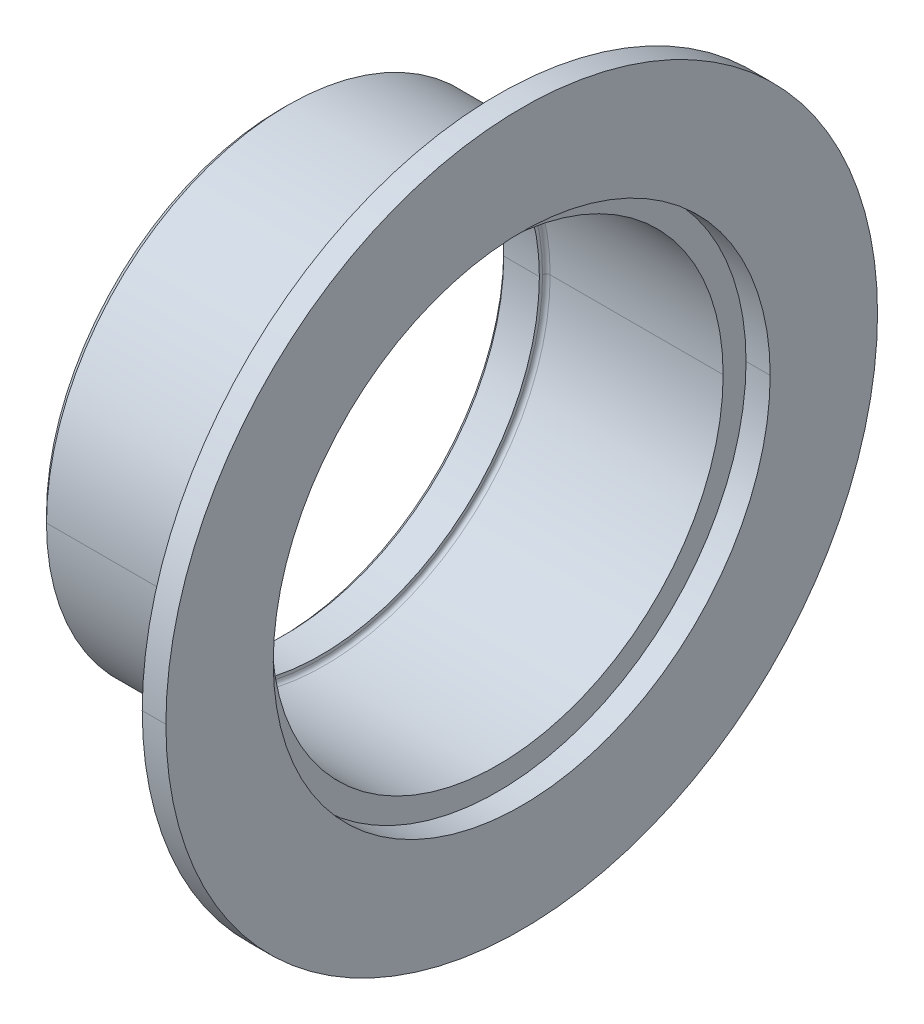
ISO-10303-21;
HEADER;
FILE_DESCRIPTION(('STEP AP214'),'2;1');
FILE_NAME('part.step','',(''),(''),'','','');
FILE_SCHEMA(('AUTOMOTIVE_DESIGN { 1 0 10303 214 1 1 1 1 }'));
ENDSEC;
DATA;
#1=APPLICATION_CONTEXT('core data for automotive mechanical design processes');
#2=APPLICATION_PROTOCOL_DEFINITION('international standard','automotive_design',2000,#1);
#3=PRODUCT_CONTEXT('',#1,'mechanical');
#4=PRODUCT('Part','Part','',(#3));
#5=PRODUCT_RELATED_PRODUCT_CATEGORY('part','',(#4));
#6=PRODUCT_DEFINITION_FORMATION('','',#4);
#7=PRODUCT_DEFINITION_CONTEXT('part definition',#1,'design');
#8=PRODUCT_DEFINITION('design','',#6,#7);
#9=PRODUCT_DEFINITION_SHAPE('','',#8);
#10=(LENGTH_UNIT() NAMED_UNIT(*) SI_UNIT(.MILLI.,.METRE.));
#11=(NAMED_UNIT(*) PLANE_ANGLE_UNIT() SI_UNIT($,.RADIAN.));
#12=(NAMED_UNIT(*) SI_UNIT($,.STERADIAN.) SOLID_ANGLE_UNIT());
#13=UNCERTAINTY_MEASURE_WITH_UNIT(LENGTH_MEASURE(1.E-05),#10,'distance_accuracy_value','');
#14=(GEOMETRIC_REPRESENTATION_CONTEXT(3) GLOBAL_UNCERTAINTY_ASSIGNED_CONTEXT((#13)) GLOBAL_UNIT_ASSIGNED_CONTEXT((#10,
#11,#12)) REPRESENTATION_CONTEXT('',''));
#15=CARTESIAN_POINT('',(0.,0.,0.));
#16=DIRECTION('',(0.,0.,1.));
#17=DIRECTION('',(1.,0.,0.));
#18=AXIS2_PLACEMENT_3D('',#15,#16,#17);
#19=CARTESIAN_POINT('',(-20.75,0.,0.));
#20=DIRECTION('',(1.,0.,0.));
#21=DIRECTION('',(0.,0.,-1.));
#22=AXIS2_PLACEMENT_3D('',#19,#20,#21);
#23=TOROIDAL_SURFACE('',#22,23.35,0.4);
#24=CARTESIAN_POINT('',(-21.15,0.,0.));
#25=DIRECTION('',(1.,0.,0.));
#26=DIRECTION('',(0.,0.,-1.));
#27=AXIS2_PLACEMENT_3D('',#24,#25,#26);
#28=CIRCLE('',#27,23.35);
#29=CARTESIAN_POINT('',(-21.15,0.,23.35));
#30=VERTEX_POINT('',#29);
#31=CARTESIAN_POINT('',(-21.15,0.,-23.35));
#32=VERTEX_POINT('',#31);
#33=EDGE_CURVE('E42',#30,#32,#28,.T.);
#34=ORIENTED_EDGE('',*,*,#33,.F.);
#35=CARTESIAN_POINT('',(-20.75,0.,23.35));
#36=DIRECTION('',(0.,1.,0.));
#37=DIRECTION('',(0.,0.,1.));
#38=AXIS2_PLACEMENT_3D('',#35,#36,#37);
#39=CIRCLE('',#38,0.4);
#40=CARTESIAN_POINT('',(-20.75,0.,23.75));
#41=VERTEX_POINT('',#40);
#42=EDGE_CURVE('E11',#30,#41,#39,.T.);
#43=ORIENTED_EDGE('',*,*,#42,.T.);
#44=CARTESIAN_POINT('',(-20.75,0.,0.));
#45=DIRECTION('',(-1.,0.,0.));
#46=DIRECTION('',(0.,0.,-1.));
#47=AXIS2_PLACEMENT_3D('',#44,#45,#46);
#48=CIRCLE('',#47,23.75);
#49=CARTESIAN_POINT('',(-20.75,0.,-23.75));
#50=VERTEX_POINT('',#49);
#51=EDGE_CURVE('E248',#50,#41,#48,.T.);
#52=ORIENTED_EDGE('',*,*,#51,.F.);
#53=CARTESIAN_POINT('',(-20.75,0.,-23.35));
#54=DIRECTION('',(0.,-1.,0.));
#55=DIRECTION('',(0.,0.,-1.));
#56=AXIS2_PLACEMENT_3D('',#53,#54,#55);
#57=CIRCLE('',#56,0.4);
#58=EDGE_CURVE('E187',#32,#50,#57,.T.);
#59=ORIENTED_EDGE('',*,*,#58,.F.);
#60=EDGE_LOOP('',(#34,#43,#52,#59));
#61=FACE_BOUND('',#60,.T.);
#62=ADVANCED_FACE('F17',(#61),#23,.F.);
#63=CARTESIAN_POINT('',(-24.9,0.,0.));
#64=DIRECTION('',(-1.,0.,0.));
#65=DIRECTION('',(0.,0.,1.));
#66=AXIS2_PLACEMENT_3D('',#63,#64,#65);
#67=CONICAL_SURFACE('',#66,23.01,0.785398163397448);
#68=CARTESIAN_POINT('',(-24.9,0.,0.));
#69=DIRECTION('',(-1.,0.,0.));
#70=DIRECTION('',(0.,0.,-1.));
#71=AXIS2_PLACEMENT_3D('',#68,#69,#70);
#72=CIRCLE('',#71,23.01);
#73=CARTESIAN_POINT('',(-24.9,0.,-23.01));
#74=VERTEX_POINT('',#73);
#75=CARTESIAN_POINT('',(-24.9,0.,23.01));
#76=VERTEX_POINT('',#75);
#77=EDGE_CURVE('E164',#74,#76,#72,.T.);
#78=ORIENTED_EDGE('',*,*,#77,.F.);
#79=DIRECTION('',(-0.707106781186548,0.,-0.707106781186548));
#80=VECTOR('',#79,1.);
#81=CARTESIAN_POINT('',(-24.9,0.,-23.01));
#82=LINE('',#81,#80);
#83=CARTESIAN_POINT('',(-25.4,0.,-23.51));
#84=VERTEX_POINT('',#83);
#85=EDGE_CURVE('E28',#74,#84,#82,.T.);
#86=ORIENTED_EDGE('',*,*,#85,.T.);
#87=CARTESIAN_POINT('',(-25.4,0.,0.));
#88=DIRECTION('',(1.,0.,0.));
#89=DIRECTION('',(0.,0.,-1.));
#90=AXIS2_PLACEMENT_3D('',#87,#88,#89);
#91=CIRCLE('',#90,23.51);
#92=CARTESIAN_POINT('',(-25.4,0.,23.51));
#93=VERTEX_POINT('',#92);
#94=EDGE_CURVE('E153',#93,#84,#91,.T.);
#95=ORIENTED_EDGE('',*,*,#94,.F.);
#96=DIRECTION('',(-0.707106781186548,0.,0.707106781186548));
#97=VECTOR('',#96,1.);
#98=CARTESIAN_POINT('',(-24.9,0.,23.01));
#99=LINE('',#98,#97);
#100=EDGE_CURVE('E173',#76,#93,#99,.T.);
#101=ORIENTED_EDGE('',*,*,#100,.F.);
#102=EDGE_LOOP('',(#78,#86,#95,#101));
#103=FACE_BOUND('',#102,.T.);
#104=ADVANCED_FACE('F163',(#103),#67,.F.);
#105=CARTESIAN_POINT('',(0.,0.,0.));
#106=DIRECTION('',(-1.,0.,0.));
#107=DIRECTION('',(0.,0.,1.));
#108=AXIS2_PLACEMENT_3D('',#105,#106,#107);
#109=CYLINDRICAL_SURFACE('',#108,23.01);
#110=CARTESIAN_POINT('',(-21.15,0.,0.));
#111=DIRECTION('',(-1.,0.,0.));
#112=DIRECTION('',(0.,0.,1.));
#113=AXIS2_PLACEMENT_3D('',#110,#111,#112);
#114=CIRCLE('',#113,23.01);
#115=CARTESIAN_POINT('',(-21.15,0.,-23.01));
#116=VERTEX_POINT('',#115);
#117=CARTESIAN_POINT('',(-21.15,0.,23.01));
#118=VERTEX_POINT('',#117);
#119=EDGE_CURVE('E195',#116,#118,#114,.T.);
#120=ORIENTED_EDGE('',*,*,#119,.F.);
#121=DIRECTION('',(-1.,0.,0.));
#122=VECTOR('',#121,1.);
#123=CARTESIAN_POINT('',(0.,0.,-23.01));
#124=LINE('',#123,#122);
#125=EDGE_CURVE('E170',#116,#74,#124,.T.);
#126=ORIENTED_EDGE('',*,*,#125,.T.);
#127=ORIENTED_EDGE('',*,*,#77,.T.);
#128=DIRECTION('',(-1.,0.,0.));
#129=VECTOR('',#128,1.);
#130=CARTESIAN_POINT('',(0.,0.,23.01));
#131=LINE('',#130,#129);
#132=EDGE_CURVE('E125',#118,#76,#131,.T.);
#133=ORIENTED_EDGE('',*,*,#132,.F.);
#134=EDGE_LOOP('',(#120,#126,#127,#133));
#135=FACE_BOUND('',#134,.T.);
#136=ADVANCED_FACE('F327',(#135),#109,.F.);
#137=CARTESIAN_POINT('',(0.,0.,0.));
#138=DIRECTION('',(-1.,0.,0.));
#139=DIRECTION('',(0.,0.,1.));
#140=AXIS2_PLACEMENT_3D('',#137,#138,#139);
#141=CYLINDRICAL_SURFACE('',#140,23.75);
#142=CARTESIAN_POINT('',(-2.54,0.,0.));
#143=DIRECTION('',(-1.,0.,0.));
#144=DIRECTION('',(0.,0.,-1.));
#145=AXIS2_PLACEMENT_3D('',#142,#143,#144);
#146=CIRCLE('',#145,23.75);
#147=CARTESIAN_POINT('',(-2.54,0.,-23.75));
#148=VERTEX_POINT('',#147);
#149=CARTESIAN_POINT('',(-2.54,0.,23.75));
#150=VERTEX_POINT('',#149);
#151=EDGE_CURVE('E137',#148,#150,#146,.T.);
#152=ORIENTED_EDGE('',*,*,#151,.F.);
#153=DIRECTION('',(-1.,0.,0.));
#154=VECTOR('',#153,1.);
#155=CARTESIAN_POINT('',(0.,0.,-23.75));
#156=LINE('',#155,#154);
#157=EDGE_CURVE('E245',#148,#50,#156,.T.);
#158=ORIENTED_EDGE('',*,*,#157,.T.);
#159=ORIENTED_EDGE('',*,*,#51,.T.);
#160=DIRECTION('',(-1.,0.,0.));
#161=VECTOR('',#160,1.);
#162=CARTESIAN_POINT('',(0.,0.,23.75));
#163=LINE('',#162,#161);
#164=EDGE_CURVE('E175',#150,#41,#163,.T.);
#165=ORIENTED_EDGE('',*,*,#164,.F.);
#166=EDGE_LOOP('',(#152,#158,#159,#165));
#167=FACE_BOUND('',#166,.T.);
#168=ADVANCED_FACE('F313',(#167),#141,.F.);
#169=CARTESIAN_POINT('',(0.,0.,0.));
#170=DIRECTION('',(1.,0.,0.));
#171=DIRECTION('',(0.,0.,-1.));
#172=AXIS2_PLACEMENT_3D('',#169,#170,#171);
#173=CYLINDRICAL_SURFACE('',#172,26.162);
#174=CARTESIAN_POINT('',(-2.54,0.,0.));
#175=DIRECTION('',(1.,0.,0.));
#176=DIRECTION('',(0.,0.,-1.));
#177=AXIS2_PLACEMENT_3D('',#174,#175,#176);
#178=CIRCLE('',#177,26.162);
#179=CARTESIAN_POINT('',(-2.54,0.,26.162));
#180=VERTEX_POINT('',#179);
#181=CARTESIAN_POINT('',(-2.54,0.,-26.162));
#182=VERTEX_POINT('',#181);
#183=EDGE_CURVE('E265',#180,#182,#178,.T.);
#184=ORIENTED_EDGE('',*,*,#183,.F.);
#185=DIRECTION('',(1.,0.,0.));
#186=VECTOR('',#185,1.);
#187=CARTESIAN_POINT('',(0.,0.,26.162));
#188=LINE('',#187,#186);
#189=CARTESIAN_POINT('',(0.,0.,26.162));
#190=VERTEX_POINT('',#189);
#191=EDGE_CURVE('E230',#180,#190,#188,.T.);
#192=ORIENTED_EDGE('',*,*,#191,.T.);
#193=CARTESIAN_POINT('',(0.,0.,0.));
#194=DIRECTION('',(-1.,0.,0.));
#195=DIRECTION('',(0.,0.,-1.));
#196=AXIS2_PLACEMENT_3D('',#193,#194,#195);
#197=CIRCLE('',#196,26.162);
#198=CARTESIAN_POINT('',(0.,0.,-26.162));
#199=VERTEX_POINT('',#198);
#200=EDGE_CURVE('E220',#199,#190,#197,.T.);
#201=ORIENTED_EDGE('',*,*,#200,.F.);
#202=DIRECTION('',(1.,0.,0.));
#203=VECTOR('',#202,1.);
#204=CARTESIAN_POINT('',(0.,0.,-26.162));
#205=LINE('',#204,#203);
#206=EDGE_CURVE('E241',#182,#199,#205,.T.);
#207=ORIENTED_EDGE('',*,*,#206,.F.);
#208=EDGE_LOOP('',(#184,#192,#201,#207));
#209=FACE_BOUND('',#208,.T.);
#210=ADVANCED_FACE('F336',(#209),#173,.F.);
#211=CARTESIAN_POINT('',(-26.67,0.,0.));
#212=DIRECTION('',(1.,0.,0.));
#213=DIRECTION('',(0.,0.,-1.));
#214=AXIS2_PLACEMENT_3D('',#211,#212,#213);
#215=CYLINDRICAL_SURFACE('',#214,37.465);
#216=CARTESIAN_POINT('',(-2.4892,0.,0.));
#217=DIRECTION('',(1.,0.,0.));
#218=DIRECTION('',(0.,0.,-1.));
#219=AXIS2_PLACEMENT_3D('',#216,#217,#218);
#220=CIRCLE('',#219,37.465);
#221=CARTESIAN_POINT('',(-2.4892,0.,-37.4649999999949));
#222=VERTEX_POINT('',#221);
#223=CARTESIAN_POINT('',(-2.4892,0.,37.4649999999949));
#224=VERTEX_POINT('',#223);
#225=EDGE_CURVE('E226',#222,#224,#220,.T.);
#226=ORIENTED_EDGE('',*,*,#225,.T.);
#227=DIRECTION('',(1.,0.,0.));
#228=VECTOR('',#227,1.);
#229=CARTESIAN_POINT('',(-26.67,0.,37.465));
#230=LINE('',#229,#228);
#231=CARTESIAN_POINT('',(0.,0.,37.465));
#232=VERTEX_POINT('',#231);
#233=EDGE_CURVE('E212',#224,#232,#230,.T.);
#234=ORIENTED_EDGE('',*,*,#233,.T.);
#235=CARTESIAN_POINT('',(0.,0.,0.));
#236=DIRECTION('',(1.,0.,0.));
#237=DIRECTION('',(0.,0.,-1.));
#238=AXIS2_PLACEMENT_3D('',#235,#236,#237);
#239=CIRCLE('',#238,37.465);
#240=CARTESIAN_POINT('',(0.,0.,-37.465));
#241=VERTEX_POINT('',#240);
#242=EDGE_CURVE('E238',#241,#232,#239,.T.);
#243=ORIENTED_EDGE('',*,*,#242,.F.);
#244=DIRECTION('',(1.,0.,0.));
#245=VECTOR('',#244,1.);
#246=CARTESIAN_POINT('',(-26.67,0.,-37.465));
#247=LINE('',#246,#245);
#248=EDGE_CURVE('E255',#222,#241,#247,.T.);
#249=ORIENTED_EDGE('',*,*,#248,.F.);
#250=EDGE_LOOP('',(#226,#234,#243,#249));
#251=FACE_BOUND('',#250,.T.);
#252=ADVANCED_FACE('F371',(#251),#215,.T.);
#253=CARTESIAN_POINT('',(-2.48919999999871,0.,0.));
#254=DIRECTION('',(1.,0.,0.));
#255=DIRECTION('',(0.,0.,-1.));
#256=AXIS2_PLACEMENT_3D('',#253,#254,#255);
#257=CONICAL_SURFACE('',#256,37.465,1.3089969389955);
#258=CARTESIAN_POINT('',(-5.72200700668321,0.,0.));
#259=DIRECTION('',(1.,0.,0.));
#260=DIRECTION('',(0.,-1.,0.));
#261=AXIS2_PLACEMENT_3D('',#258,#259,#260);
#262=CIRCLE('',#261,25.4000000000004);
#263=CARTESIAN_POINT('',(-5.72200700668321,0.,-25.4000000000004));
#264=VERTEX_POINT('',#263);
#265=CARTESIAN_POINT('',(-5.72200700668321,0.,25.4000000000004));
#266=VERTEX_POINT('',#265);
#267=EDGE_CURVE('E208',#264,#266,#262,.T.);
#268=ORIENTED_EDGE('',*,*,#267,.T.);
#269=DIRECTION('',(0.25881904510276,0.,0.965925826289004));
#270=VECTOR('',#269,1.);
#271=CARTESIAN_POINT('',(-2.48919999999871,0.,37.465));
#272=LINE('',#271,#270);
#273=EDGE_CURVE('E213',#266,#224,#272,.T.);
#274=ORIENTED_EDGE('',*,*,#273,.T.);
#275=ORIENTED_EDGE('',*,*,#225,.F.);
#276=DIRECTION('',(0.25881904510276,0.,-0.965925826289004));
#277=VECTOR('',#276,1.);
#278=CARTESIAN_POINT('',(-2.48919999999871,0.,-37.465));
#279=LINE('',#278,#277);
#280=EDGE_CURVE('E207',#264,#222,#279,.T.);
#281=ORIENTED_EDGE('',*,*,#280,.F.);
#282=EDGE_LOOP('',(#268,#274,#275,#281));
#283=FACE_BOUND('',#282,.T.);
#284=ADVANCED_FACE('F366',(#283),#257,.T.);
#285=CARTESIAN_POINT('',(-26.67,0.,0.));
#286=DIRECTION('',(1.,0.,0.));
#287=DIRECTION('',(0.,0.,-1.));
#288=AXIS2_PLACEMENT_3D('',#285,#286,#287);
#289=CYLINDRICAL_SURFACE('',#288,25.4);
#290=CARTESIAN_POINT('',(-24.638,0.,0.));
#291=DIRECTION('',(1.,0.,0.));
#292=DIRECTION('',(0.,0.,-1.));
#293=AXIS2_PLACEMENT_3D('',#290,#291,#292);
#294=CIRCLE('',#293,25.4);
#295=CARTESIAN_POINT('',(-24.638,0.,-25.4));
#296=VERTEX_POINT('',#295);
#297=CARTESIAN_POINT('',(-24.638,0.,25.4));
#298=VERTEX_POINT('',#297);
#299=EDGE_CURVE('E266',#296,#298,#294,.T.);
#300=ORIENTED_EDGE('',*,*,#299,.T.);
#301=DIRECTION('',(1.,0.,0.));
#302=VECTOR('',#301,1.);
#303=CARTESIAN_POINT('',(-26.67,0.,25.4));
#304=LINE('',#303,#302);
#305=EDGE_CURVE('E270',#298,#266,#304,.T.);
#306=ORIENTED_EDGE('',*,*,#305,.T.);
#307=ORIENTED_EDGE('',*,*,#267,.F.);
#308=DIRECTION('',(1.,0.,0.));
#309=VECTOR('',#308,1.);
#310=CARTESIAN_POINT('',(-26.67,0.,-25.4));
#311=LINE('',#310,#309);
#312=EDGE_CURVE('E186',#296,#264,#311,.T.);
#313=ORIENTED_EDGE('',*,*,#312,.F.);
#314=EDGE_LOOP('',(#300,#306,#307,#313));
#315=FACE_BOUND('',#314,.T.);
#316=ADVANCED_FACE('F363',(#315),#289,.T.);
#317=CARTESIAN_POINT('',(-24.638,0.,0.));
#318=DIRECTION('',(1.,0.,0.));
#319=DIRECTION('',(0.,0.,-1.));
#320=AXIS2_PLACEMENT_3D('',#317,#318,#319);
#321=CONICAL_SURFACE('',#320,25.4,0.785398163397298);
#322=CARTESIAN_POINT('',(-25.4,0.,0.));
#323=DIRECTION('',(1.,0.,0.));
#324=DIRECTION('',(0.,0.,-1.));
#325=AXIS2_PLACEMENT_3D('',#322,#323,#324);
#326=CIRCLE('',#325,24.638);
#327=CARTESIAN_POINT('',(-25.4,0.,-24.638));
#328=VERTEX_POINT('',#327);
#329=CARTESIAN_POINT('',(-25.4,0.,24.638));
#330=VERTEX_POINT('',#329);
#331=EDGE_CURVE('E237',#328,#330,#326,.T.);
#332=ORIENTED_EDGE('',*,*,#331,.T.);
#333=DIRECTION('',(0.707106781186654,0.,0.707106781186441));
#334=VECTOR('',#333,1.);
#335=CARTESIAN_POINT('',(-24.638,0.,25.4));
#336=LINE('',#335,#334);
#337=EDGE_CURVE('E234',#330,#298,#336,.T.);
#338=ORIENTED_EDGE('',*,*,#337,.T.);
#339=ORIENTED_EDGE('',*,*,#299,.F.);
#340=DIRECTION('',(0.707106781186654,0.,-0.707106781186441));
#341=VECTOR('',#340,1.);
#342=CARTESIAN_POINT('',(-24.638,0.,-25.4));
#343=LINE('',#342,#341);
#344=EDGE_CURVE('E160',#328,#296,#343,.T.);
#345=ORIENTED_EDGE('',*,*,#344,.F.);
#346=EDGE_LOOP('',(#332,#338,#339,#345));
#347=FACE_BOUND('',#346,.T.);
#348=ADVANCED_FACE('F365',(#347),#321,.T.);
#349=CARTESIAN_POINT('',(0.,0.,0.));
#350=DIRECTION('',(1.,0.,0.));
#351=DIRECTION('',(0.,1.,0.));
#352=AXIS2_PLACEMENT_3D('',#349,#350,#351);
#353=PLANE('',#352);
#354=ORIENTED_EDGE('',*,*,#242,.T.);
#355=CARTESIAN_POINT('',(0.,0.,0.));
#356=DIRECTION('',(1.,0.,0.));
#357=DIRECTION('',(0.,0.,-1.));
#358=AXIS2_PLACEMENT_3D('',#355,#356,#357);
#359=CIRCLE('',#358,37.465);
#360=EDGE_CURVE('E224',#232,#241,#359,.T.);
#361=ORIENTED_EDGE('',*,*,#360,.T.);
#362=EDGE_LOOP('',(#354,#361));
#363=FACE_BOUND('',#362,.T.);
#364=ORIENTED_EDGE('',*,*,#200,.T.);
#365=CARTESIAN_POINT('',(0.,0.,0.));
#366=DIRECTION('',(-1.,0.,0.));
#367=DIRECTION('',(0.,0.,-1.));
#368=AXIS2_PLACEMENT_3D('',#365,#366,#367);
#369=CIRCLE('',#368,26.162);
#370=EDGE_CURVE('E225',#190,#199,#369,.T.);
#371=ORIENTED_EDGE('',*,*,#370,.T.);
#372=EDGE_LOOP('',(#364,#371));
#373=FACE_BOUND('',#372,.T.);
#374=ADVANCED_FACE('F361',(#363,#373),#353,.T.);
#375=CARTESIAN_POINT('',(0.,0.,0.));
#376=DIRECTION('',(1.,0.,0.));
#377=DIRECTION('',(0.,0.,-1.));
#378=AXIS2_PLACEMENT_3D('',#375,#376,#377);
#379=CYLINDRICAL_SURFACE('',#378,26.162);
#380=ORIENTED_EDGE('',*,*,#191,.F.);
#381=CARTESIAN_POINT('',(-2.54,0.,0.));
#382=DIRECTION('',(1.,0.,0.));
#383=DIRECTION('',(0.,0.,-1.));
#384=AXIS2_PLACEMENT_3D('',#381,#382,#383);
#385=CIRCLE('',#384,26.162);
#386=EDGE_CURVE('E258',#182,#180,#385,.T.);
#387=ORIENTED_EDGE('',*,*,#386,.F.);
#388=ORIENTED_EDGE('',*,*,#206,.T.);
#389=ORIENTED_EDGE('',*,*,#370,.F.);
#390=EDGE_LOOP('',(#380,#387,#388,#389));
#391=FACE_BOUND('',#390,.T.);
#392=ADVANCED_FACE('F357',(#391),#379,.F.);
#393=CARTESIAN_POINT('',(-26.67,0.,0.));
#394=DIRECTION('',(1.,0.,0.));
#395=DIRECTION('',(0.,0.,-1.));
#396=AXIS2_PLACEMENT_3D('',#393,#394,#395);
#397=CYLINDRICAL_SURFACE('',#396,37.465);
#398=ORIENTED_EDGE('',*,*,#233,.F.);
#399=CARTESIAN_POINT('',(-2.4892,0.,0.));
#400=DIRECTION('',(1.,0.,0.));
#401=DIRECTION('',(0.,0.,-1.));
#402=AXIS2_PLACEMENT_3D('',#399,#400,#401);
#403=CIRCLE('',#402,37.465);
#404=EDGE_CURVE('E243',#224,#222,#403,.T.);
#405=ORIENTED_EDGE('',*,*,#404,.T.);
#406=ORIENTED_EDGE('',*,*,#248,.T.);
#407=ORIENTED_EDGE('',*,*,#360,.F.);
#408=EDGE_LOOP('',(#398,#405,#406,#407));
#409=FACE_BOUND('',#408,.T.);
#410=ADVANCED_FACE('F360',(#409),#397,.T.);
#411=CARTESIAN_POINT('',(-2.54,0.,0.));
#412=DIRECTION('',(1.,0.,0.));
#413=DIRECTION('',(0.,1.,0.));
#414=AXIS2_PLACEMENT_3D('',#411,#412,#413);
#415=PLANE('',#414);
#416=ORIENTED_EDGE('',*,*,#386,.T.);
#417=ORIENTED_EDGE('',*,*,#183,.T.);
#418=EDGE_LOOP('',(#416,#417));
#419=FACE_BOUND('',#418,.T.);
#420=CARTESIAN_POINT('',(-2.54,0.,0.));
#421=DIRECTION('',(-1.,0.,0.));
#422=DIRECTION('',(0.,0.,-1.));
#423=AXIS2_PLACEMENT_3D('',#420,#421,#422);
#424=CIRCLE('',#423,23.75);
#425=EDGE_CURVE('E286',#150,#148,#424,.T.);
#426=ORIENTED_EDGE('',*,*,#425,.T.);
#427=ORIENTED_EDGE('',*,*,#151,.T.);
#428=EDGE_LOOP('',(#426,#427));
#429=FACE_BOUND('',#428,.T.);
#430=ADVANCED_FACE('F19',(#419,#429),#415,.T.);
#431=CARTESIAN_POINT('',(-2.48919999999871,0.,0.));
#432=DIRECTION('',(1.,0.,0.));
#433=DIRECTION('',(0.,0.,-1.));
#434=AXIS2_PLACEMENT_3D('',#431,#432,#433);
#435=CONICAL_SURFACE('',#434,37.465,1.3089969389955);
#436=ORIENTED_EDGE('',*,*,#273,.F.);
#437=CARTESIAN_POINT('',(-5.72200700668321,0.,0.));
#438=DIRECTION('',(1.,0.,0.));
#439=DIRECTION('',(0.,-1.,0.));
#440=AXIS2_PLACEMENT_3D('',#437,#438,#439);
#441=CIRCLE('',#440,25.4000000000004);
#442=EDGE_CURVE('E203',#266,#264,#441,.T.);
#443=ORIENTED_EDGE('',*,*,#442,.T.);
#444=ORIENTED_EDGE('',*,*,#280,.T.);
#445=ORIENTED_EDGE('',*,*,#404,.F.);
#446=EDGE_LOOP('',(#436,#443,#444,#445));
#447=FACE_BOUND('',#446,.T.);
#448=ADVANCED_FACE('F352',(#447),#435,.T.);
#449=CARTESIAN_POINT('',(-26.67,0.,0.));
#450=DIRECTION('',(1.,0.,0.));
#451=DIRECTION('',(0.,0.,-1.));
#452=AXIS2_PLACEMENT_3D('',#449,#450,#451);
#453=CYLINDRICAL_SURFACE('',#452,25.4);
#454=ORIENTED_EDGE('',*,*,#305,.F.);
#455=CARTESIAN_POINT('',(-24.638,0.,0.));
#456=DIRECTION('',(1.,0.,0.));
#457=DIRECTION('',(0.,0.,-1.));
#458=AXIS2_PLACEMENT_3D('',#455,#456,#457);
#459=CIRCLE('',#458,25.4);
#460=EDGE_CURVE('E216',#298,#296,#459,.T.);
#461=ORIENTED_EDGE('',*,*,#460,.T.);
#462=ORIENTED_EDGE('',*,*,#312,.T.);
#463=ORIENTED_EDGE('',*,*,#442,.F.);
#464=EDGE_LOOP('',(#454,#461,#462,#463));
#465=FACE_BOUND('',#464,.T.);
#466=ADVANCED_FACE('F350',(#465),#453,.T.);
#467=CARTESIAN_POINT('',(-24.638,0.,0.));
#468=DIRECTION('',(1.,0.,0.));
#469=DIRECTION('',(0.,0.,-1.));
#470=AXIS2_PLACEMENT_3D('',#467,#468,#469);
#471=CONICAL_SURFACE('',#470,25.4,0.785398163397298);
#472=ORIENTED_EDGE('',*,*,#337,.F.);
#473=CARTESIAN_POINT('',(-25.4,0.,0.));
#474=DIRECTION('',(1.,0.,0.));
#475=DIRECTION('',(0.,0.,-1.));
#476=AXIS2_PLACEMENT_3D('',#473,#474,#475);
#477=CIRCLE('',#476,24.638);
#478=EDGE_CURVE('E21',#330,#328,#477,.T.);
#479=ORIENTED_EDGE('',*,*,#478,.T.);
#480=ORIENTED_EDGE('',*,*,#344,.T.);
#481=ORIENTED_EDGE('',*,*,#460,.F.);
#482=EDGE_LOOP('',(#472,#479,#480,#481));
#483=FACE_BOUND('',#482,.T.);
#484=ADVANCED_FACE('F348',(#483),#471,.T.);
#485=CARTESIAN_POINT('',(-25.4,0.,0.));
#486=DIRECTION('',(1.,0.,0.));
#487=DIRECTION('',(0.,1.,0.));
#488=AXIS2_PLACEMENT_3D('',#485,#486,#487);
#489=PLANE('',#488);
#490=ORIENTED_EDGE('',*,*,#331,.F.);
#491=ORIENTED_EDGE('',*,*,#478,.F.);
#492=EDGE_LOOP('',(#490,#491));
#493=FACE_BOUND('',#492,.T.);
#494=ORIENTED_EDGE('',*,*,#94,.T.);
#495=CARTESIAN_POINT('',(-25.4,0.,0.));
#496=DIRECTION('',(1.,0.,0.));
#497=DIRECTION('',(0.,0.,-1.));
#498=AXIS2_PLACEMENT_3D('',#495,#496,#497);
#499=CIRCLE('',#498,23.51);
#500=EDGE_CURVE('E157',#84,#93,#499,.T.);
#501=ORIENTED_EDGE('',*,*,#500,.T.);
#502=EDGE_LOOP('',(#494,#501));
#503=FACE_BOUND('',#502,.T.);
#504=ADVANCED_FACE('F155',(#493,#503),#489,.F.);
#505=CARTESIAN_POINT('',(0.,0.,0.));
#506=DIRECTION('',(-1.,0.,0.));
#507=DIRECTION('',(0.,0.,1.));
#508=AXIS2_PLACEMENT_3D('',#505,#506,#507);
#509=CYLINDRICAL_SURFACE('',#508,23.75);
#510=ORIENTED_EDGE('',*,*,#157,.F.);
#511=ORIENTED_EDGE('',*,*,#425,.F.);
#512=ORIENTED_EDGE('',*,*,#164,.T.);
#513=CARTESIAN_POINT('',(-20.75,0.,0.));
#514=DIRECTION('',(-1.,0.,0.));
#515=DIRECTION('',(0.,0.,-1.));
#516=AXIS2_PLACEMENT_3D('',#513,#514,#515);
#517=CIRCLE('',#516,23.75);
#518=EDGE_CURVE('E182',#41,#50,#517,.T.);
#519=ORIENTED_EDGE('',*,*,#518,.T.);
#520=EDGE_LOOP('',(#510,#511,#512,#519));
#521=FACE_BOUND('',#520,.T.);
#522=ADVANCED_FACE('F311',(#521),#509,.F.);
#523=CARTESIAN_POINT('',(-21.15,23.01,0.));
#524=DIRECTION('',(1.,0.,0.));
#525=DIRECTION('',(0.,1.,0.));
#526=AXIS2_PLACEMENT_3D('',#523,#524,#525);
#527=PLANE('',#526);
#528=CARTESIAN_POINT('',(-21.15,0.,0.));
#529=DIRECTION('',(1.,0.,0.));
#530=DIRECTION('',(0.,0.,-1.));
#531=AXIS2_PLACEMENT_3D('',#528,#529,#530);
#532=CIRCLE('',#531,23.35);
#533=EDGE_CURVE('E199',#32,#30,#532,.T.);
#534=ORIENTED_EDGE('',*,*,#533,.T.);
#535=ORIENTED_EDGE('',*,*,#33,.T.);
#536=EDGE_LOOP('',(#534,#535));
#537=FACE_BOUND('',#536,.T.);
#538=CARTESIAN_POINT('',(-21.15,0.,0.));
#539=DIRECTION('',(-1.,0.,0.));
#540=DIRECTION('',(0.,0.,1.));
#541=AXIS2_PLACEMENT_3D('',#538,#539,#540);
#542=CIRCLE('',#541,23.01);
#543=EDGE_CURVE('E191',#118,#116,#542,.T.);
#544=ORIENTED_EDGE('',*,*,#543,.T.);
#545=ORIENTED_EDGE('',*,*,#119,.T.);
#546=EDGE_LOOP('',(#544,#545));
#547=FACE_BOUND('',#546,.T.);
#548=ADVANCED_FACE('F319',(#537,#547),#527,.T.);
#549=CARTESIAN_POINT('',(0.,0.,0.));
#550=DIRECTION('',(-1.,0.,0.));
#551=DIRECTION('',(0.,0.,1.));
#552=AXIS2_PLACEMENT_3D('',#549,#550,#551);
#553=CYLINDRICAL_SURFACE('',#552,23.01);
#554=ORIENTED_EDGE('',*,*,#125,.F.);
#555=ORIENTED_EDGE('',*,*,#543,.F.);
#556=ORIENTED_EDGE('',*,*,#132,.T.);
#557=CARTESIAN_POINT('',(-24.9,0.,0.));
#558=DIRECTION('',(-1.,0.,0.));
#559=DIRECTION('',(0.,0.,-1.));
#560=AXIS2_PLACEMENT_3D('',#557,#558,#559);
#561=CIRCLE('',#560,23.01);
#562=EDGE_CURVE('E196',#76,#74,#561,.T.);
#563=ORIENTED_EDGE('',*,*,#562,.T.);
#564=EDGE_LOOP('',(#554,#555,#556,#563));
#565=FACE_BOUND('',#564,.T.);
#566=ADVANCED_FACE('F322',(#565),#553,.F.);
#567=CARTESIAN_POINT('',(-24.9,0.,0.));
#568=DIRECTION('',(-1.,0.,0.));
#569=DIRECTION('',(0.,0.,1.));
#570=AXIS2_PLACEMENT_3D('',#567,#568,#569);
#571=CONICAL_SURFACE('',#570,23.01,0.785398163397448);
#572=ORIENTED_EDGE('',*,*,#85,.F.);
#573=ORIENTED_EDGE('',*,*,#562,.F.);
#574=ORIENTED_EDGE('',*,*,#100,.T.);
#575=ORIENTED_EDGE('',*,*,#500,.F.);
#576=EDGE_LOOP('',(#572,#573,#574,#575));
#577=FACE_BOUND('',#576,.T.);
#578=ADVANCED_FACE('F172',(#577),#571,.F.);
#579=CARTESIAN_POINT('',(-20.75,0.,0.));
#580=DIRECTION('',(1.,0.,0.));
#581=DIRECTION('',(0.,0.,-1.));
#582=AXIS2_PLACEMENT_3D('',#579,#580,#581);
#583=TOROIDAL_SURFACE('',#582,23.35,0.4);
#584=ORIENTED_EDGE('',*,*,#42,.F.);
#585=ORIENTED_EDGE('',*,*,#533,.F.);
#586=ORIENTED_EDGE('',*,*,#58,.T.);
#587=ORIENTED_EDGE('',*,*,#518,.F.);
#588=EDGE_LOOP('',(#584,#585,#586,#587));
#589=FACE_BOUND('',#588,.T.);
#590=ADVANCED_FACE('F317',(#589),#583,.F.);
#591=CLOSED_SHELL('',(#62,#104,#136,#168,#210,#252,#284,#316,#348,#374,#392,#410,#430,#448,#466,
#484,#504,#522,#548,#566,#578,#590));
#592=MANIFOLD_SOLID_BREP('B1',#591);
#593=ADVANCED_BREP_SHAPE_REPRESENTATION('',(#18,#592),#14);
#594=SHAPE_DEFINITION_REPRESENTATION(#9,#593);
ENDSEC;
END-ISO-10303-21;
